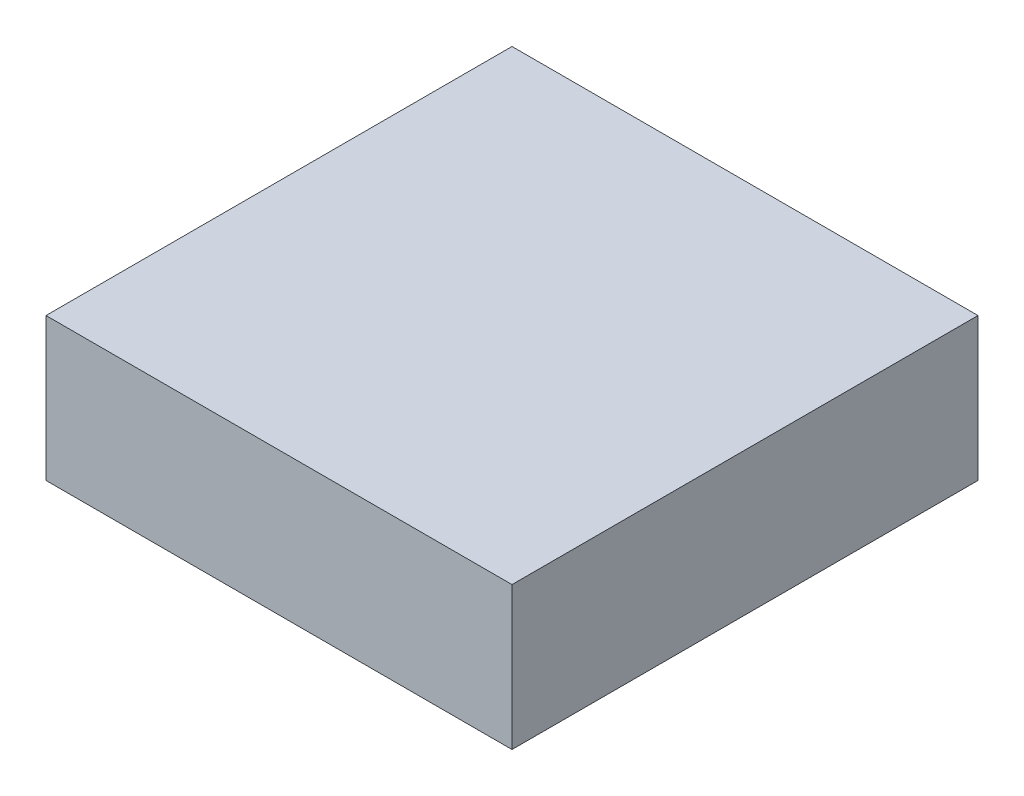
ISO-10303-21;
HEADER;
FILE_DESCRIPTION(('STEP AP214'),'2;1');
FILE_NAME('part.step','',(''),(''),'','','');
FILE_SCHEMA(('AUTOMOTIVE_DESIGN { 1 0 10303 214 1 1 1 1 }'));
ENDSEC;
DATA;
#1=APPLICATION_CONTEXT('core data for automotive mechanical design processes');
#2=APPLICATION_PROTOCOL_DEFINITION('international standard','automotive_design',2000,#1);
#3=PRODUCT_CONTEXT('',#1,'mechanical');
#4=PRODUCT('Part','Part','',(#3));
#5=PRODUCT_RELATED_PRODUCT_CATEGORY('part','',(#4));
#6=PRODUCT_DEFINITION_FORMATION('','',#4);
#7=PRODUCT_DEFINITION_CONTEXT('part definition',#1,'design');
#8=PRODUCT_DEFINITION('design','',#6,#7);
#9=PRODUCT_DEFINITION_SHAPE('','',#8);
#10=(LENGTH_UNIT() NAMED_UNIT(*) SI_UNIT(.MILLI.,.METRE.));
#11=(NAMED_UNIT(*) PLANE_ANGLE_UNIT() SI_UNIT($,.RADIAN.));
#12=(NAMED_UNIT(*) SI_UNIT($,.STERADIAN.) SOLID_ANGLE_UNIT());
#13=UNCERTAINTY_MEASURE_WITH_UNIT(LENGTH_MEASURE(1.E-05),#10,'distance_accuracy_value','');
#14=(GEOMETRIC_REPRESENTATION_CONTEXT(3) GLOBAL_UNCERTAINTY_ASSIGNED_CONTEXT((#13)) GLOBAL_UNIT_ASSIGNED_CONTEXT((#10,
#11,#12)) REPRESENTATION_CONTEXT('',''));
#15=CARTESIAN_POINT('',(0.,0.,0.));
#16=DIRECTION('',(0.,0.,1.));
#17=DIRECTION('',(1.,0.,0.));
#18=AXIS2_PLACEMENT_3D('',#15,#16,#17);
#19=CARTESIAN_POINT('',(35.7,-10.945,71.4));
#20=DIRECTION('',(-1.,0.,0.));
#21=DIRECTION('',(0.,0.,1.));
#22=AXIS2_PLACEMENT_3D('',#19,#20,#21);
#23=PLANE('',#22);
#24=DIRECTION('',(0.,1.,0.));
#25=VECTOR('',#24,1.);
#26=CARTESIAN_POINT('',(35.7,-10.945,0.));
#27=LINE('',#26,#25);
#28=CARTESIAN_POINT('',(35.7,-10.945,0.));
#29=VERTEX_POINT('',#28);
#30=CARTESIAN_POINT('',(35.7,10.945,0.));
#31=VERTEX_POINT('',#30);
#32=EDGE_CURVE('E102',#29,#31,#27,.T.);
#33=ORIENTED_EDGE('',*,*,#32,.T.);
#34=DIRECTION('',(0.,0.,-1.));
#35=VECTOR('',#34,1.);
#36=CARTESIAN_POINT('',(35.7,10.945,71.4));
#37=LINE('',#36,#35);
#38=CARTESIAN_POINT('',(35.7,10.945,71.4));
#39=VERTEX_POINT('',#38);
#40=EDGE_CURVE('E11',#39,#31,#37,.T.);
#41=ORIENTED_EDGE('',*,*,#40,.F.);
#42=DIRECTION('',(0.,1.,0.));
#43=VECTOR('',#42,1.);
#44=CARTESIAN_POINT('',(35.7,-10.945,71.4));
#45=LINE('',#44,#43);
#46=CARTESIAN_POINT('',(35.7,-10.945,71.4));
#47=VERTEX_POINT('',#46);
#48=EDGE_CURVE('E90',#47,#39,#45,.T.);
#49=ORIENTED_EDGE('',*,*,#48,.F.);
#50=DIRECTION('',(0.,0.,-1.));
#51=VECTOR('',#50,1.);
#52=CARTESIAN_POINT('',(35.7,-10.945,71.4));
#53=LINE('',#52,#51);
#54=EDGE_CURVE('E98',#47,#29,#53,.T.);
#55=ORIENTED_EDGE('',*,*,#54,.T.);
#56=EDGE_LOOP('',(#33,#41,#49,#55));
#57=FACE_BOUND('',#56,.T.);
#58=ADVANCED_FACE('F39',(#57),#23,.F.);
#59=CARTESIAN_POINT('',(-35.7,10.945,71.4));
#60=DIRECTION('',(0.,-1.,0.));
#61=DIRECTION('',(0.,0.,-1.));
#62=AXIS2_PLACEMENT_3D('',#59,#60,#61);
#63=PLANE('',#62);
#64=DIRECTION('',(-1.,0.,0.));
#65=VECTOR('',#64,1.);
#66=CARTESIAN_POINT('',(-35.7,10.945,0.));
#67=LINE('',#66,#65);
#68=CARTESIAN_POINT('',(-35.7,10.945,0.));
#69=VERTEX_POINT('',#68);
#70=EDGE_CURVE('E94',#31,#69,#67,.T.);
#71=ORIENTED_EDGE('',*,*,#70,.T.);
#72=DIRECTION('',(0.,0.,-1.));
#73=VECTOR('',#72,1.);
#74=CARTESIAN_POINT('',(-35.7,10.945,71.4));
#75=LINE('',#74,#73);
#76=CARTESIAN_POINT('',(-35.7,10.945,71.4));
#77=VERTEX_POINT('',#76);
#78=EDGE_CURVE('E47',#77,#69,#75,.T.);
#79=ORIENTED_EDGE('',*,*,#78,.F.);
#80=DIRECTION('',(-1.,0.,0.));
#81=VECTOR('',#80,1.);
#82=CARTESIAN_POINT('',(-35.7,10.945,71.4));
#83=LINE('',#82,#81);
#84=EDGE_CURVE('E85',#39,#77,#83,.T.);
#85=ORIENTED_EDGE('',*,*,#84,.F.);
#86=ORIENTED_EDGE('',*,*,#40,.T.);
#87=EDGE_LOOP('',(#71,#79,#85,#86));
#88=FACE_BOUND('',#87,.T.);
#89=ADVANCED_FACE('F93',(#88),#63,.F.);
#90=CARTESIAN_POINT('',(-35.7,-10.945,71.4));
#91=DIRECTION('',(1.,0.,0.));
#92=DIRECTION('',(0.,0.,-1.));
#93=AXIS2_PLACEMENT_3D('',#90,#91,#92);
#94=PLANE('',#93);
#95=DIRECTION('',(0.,-1.,0.));
#96=VECTOR('',#95,1.);
#97=CARTESIAN_POINT('',(-35.7,-10.945,0.));
#98=LINE('',#97,#96);
#99=CARTESIAN_POINT('',(-35.7,-10.945,0.));
#100=VERTEX_POINT('',#99);
#101=EDGE_CURVE('E72',#69,#100,#98,.T.);
#102=ORIENTED_EDGE('',*,*,#101,.T.);
#103=DIRECTION('',(0.,0.,-1.));
#104=VECTOR('',#103,1.);
#105=CARTESIAN_POINT('',(-35.7,-10.945,71.4));
#106=LINE('',#105,#104);
#107=CARTESIAN_POINT('',(-35.7,-10.945,71.4));
#108=VERTEX_POINT('',#107);
#109=EDGE_CURVE('E95',#108,#100,#106,.T.);
#110=ORIENTED_EDGE('',*,*,#109,.F.);
#111=DIRECTION('',(0.,-1.,0.));
#112=VECTOR('',#111,1.);
#113=CARTESIAN_POINT('',(-35.7,-10.945,71.4));
#114=LINE('',#113,#112);
#115=EDGE_CURVE('E88',#77,#108,#114,.T.);
#116=ORIENTED_EDGE('',*,*,#115,.F.);
#117=ORIENTED_EDGE('',*,*,#78,.T.);
#118=EDGE_LOOP('',(#102,#110,#116,#117));
#119=FACE_BOUND('',#118,.T.);
#120=ADVANCED_FACE('F96',(#119),#94,.F.);
#121=CARTESIAN_POINT('',(-35.7,-10.945,71.4));
#122=DIRECTION('',(0.,1.,0.));
#123=DIRECTION('',(0.,0.,1.));
#124=AXIS2_PLACEMENT_3D('',#121,#122,#123);
#125=PLANE('',#124);
#126=DIRECTION('',(1.,0.,0.));
#127=VECTOR('',#126,1.);
#128=CARTESIAN_POINT('',(-35.7,-10.945,0.));
#129=LINE('',#128,#127);
#130=EDGE_CURVE('E78',#100,#29,#129,.T.);
#131=ORIENTED_EDGE('',*,*,#130,.T.);
#132=ORIENTED_EDGE('',*,*,#54,.F.);
#133=DIRECTION('',(1.,0.,0.));
#134=VECTOR('',#133,1.);
#135=CARTESIAN_POINT('',(-35.7,-10.945,71.4));
#136=LINE('',#135,#134);
#137=EDGE_CURVE('E55',#108,#47,#136,.T.);
#138=ORIENTED_EDGE('',*,*,#137,.F.);
#139=ORIENTED_EDGE('',*,*,#109,.T.);
#140=EDGE_LOOP('',(#131,#132,#138,#139));
#141=FACE_BOUND('',#140,.T.);
#142=ADVANCED_FACE('F109',(#141),#125,.F.);
#143=CARTESIAN_POINT('',(0.,0.,71.4));
#144=DIRECTION('',(0.,0.,-1.));
#145=DIRECTION('',(-1.,0.,0.));
#146=AXIS2_PLACEMENT_3D('',#143,#144,#145);
#147=PLANE('',#146);
#148=ORIENTED_EDGE('',*,*,#48,.T.);
#149=ORIENTED_EDGE('',*,*,#84,.T.);
#150=ORIENTED_EDGE('',*,*,#115,.T.);
#151=ORIENTED_EDGE('',*,*,#137,.T.);
#152=EDGE_LOOP('',(#148,#149,#150,#151));
#153=FACE_BOUND('',#152,.T.);
#154=ADVANCED_FACE('F86',(#153),#147,.F.);
#155=CARTESIAN_POINT('',(0.,0.,0.));
#156=DIRECTION('',(0.,0.,-1.));
#157=DIRECTION('',(-1.,0.,0.));
#158=AXIS2_PLACEMENT_3D('',#155,#156,#157);
#159=PLANE('',#158);
#160=ORIENTED_EDGE('',*,*,#32,.F.);
#161=ORIENTED_EDGE('',*,*,#130,.F.);
#162=ORIENTED_EDGE('',*,*,#101,.F.);
#163=ORIENTED_EDGE('',*,*,#70,.F.);
#164=EDGE_LOOP('',(#160,#161,#162,#163));
#165=FACE_BOUND('',#164,.T.);
#166=ADVANCED_FACE('F112',(#165),#159,.T.);
#167=CLOSED_SHELL('',(#58,#89,#120,#142,#154,#166));
#168=MANIFOLD_SOLID_BREP('B2',#167);
#169=ADVANCED_BREP_SHAPE_REPRESENTATION('',(#18,#168),#14);
#170=SHAPE_DEFINITION_REPRESENTATION(#9,#169);
ENDSEC;
END-ISO-10303-21;
